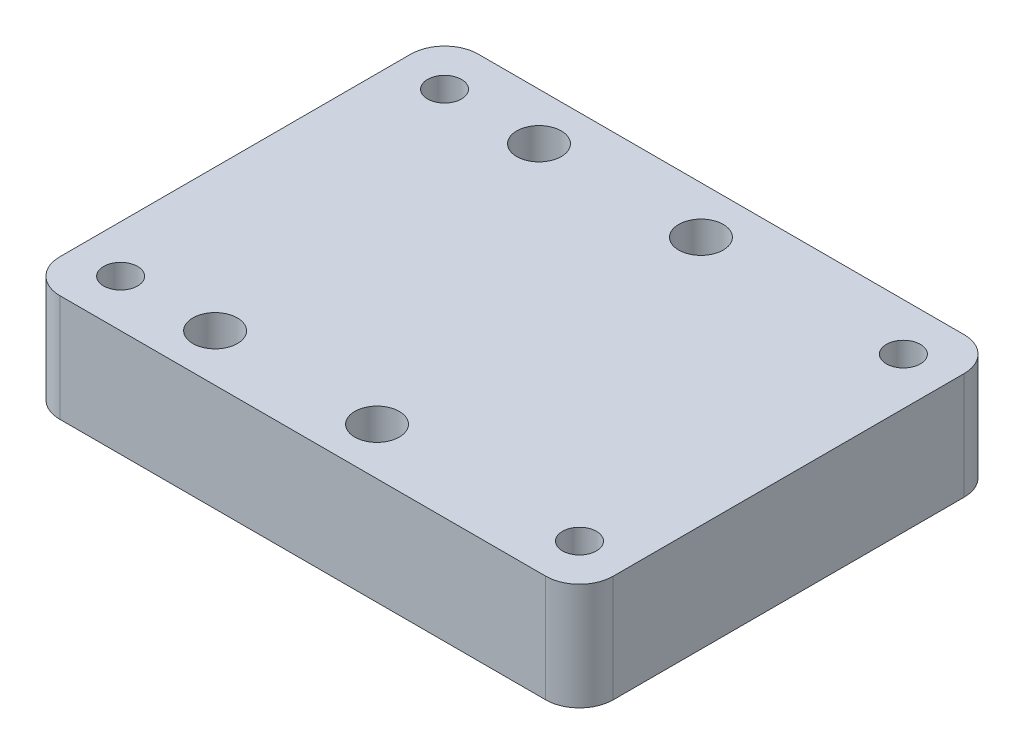
ISO-10303-21;
HEADER;
FILE_DESCRIPTION(('STEP AP214'),'2;1');
FILE_NAME('part.step','',(''),(''),'','','');
FILE_SCHEMA(('AUTOMOTIVE_DESIGN { 1 0 10303 214 1 1 1 1 }'));
ENDSEC;
DATA;
#1=APPLICATION_CONTEXT('core data for automotive mechanical design processes');
#2=APPLICATION_PROTOCOL_DEFINITION('international standard','automotive_design',2000,#1);
#3=PRODUCT_CONTEXT('',#1,'mechanical');
#4=PRODUCT('Part','Part','',(#3));
#5=PRODUCT_RELATED_PRODUCT_CATEGORY('part','',(#4));
#6=PRODUCT_DEFINITION_FORMATION('','',#4);
#7=PRODUCT_DEFINITION_CONTEXT('part definition',#1,'design');
#8=PRODUCT_DEFINITION('design','',#6,#7);
#9=PRODUCT_DEFINITION_SHAPE('','',#8);
#10=(LENGTH_UNIT() NAMED_UNIT(*) SI_UNIT(.MILLI.,.METRE.));
#11=(NAMED_UNIT(*) PLANE_ANGLE_UNIT() SI_UNIT($,.RADIAN.));
#12=(NAMED_UNIT(*) SI_UNIT($,.STERADIAN.) SOLID_ANGLE_UNIT());
#13=UNCERTAINTY_MEASURE_WITH_UNIT(LENGTH_MEASURE(1.E-05),#10,'distance_accuracy_value','');
#14=(GEOMETRIC_REPRESENTATION_CONTEXT(3) GLOBAL_UNCERTAINTY_ASSIGNED_CONTEXT((#13)) GLOBAL_UNIT_ASSIGNED_CONTEXT((#10,
#11,#12)) REPRESENTATION_CONTEXT('',''));
#15=CARTESIAN_POINT('',(0.,0.,0.));
#16=DIRECTION('',(0.,0.,1.));
#17=DIRECTION('',(1.,0.,0.));
#18=AXIS2_PLACEMENT_3D('',#15,#16,#17);
#19=CARTESIAN_POINT('',(399.991475985945,15.875,37.6694276450719));
#20=DIRECTION('',(0.,1.,0.));
#21=DIRECTION('',(1.,0.,0.));
#22=AXIS2_PLACEMENT_3D('',#19,#20,#21);
#23=PLANE('',#22);
#24=CARTESIAN_POINT('',(365.991475985945,15.875,61.6694276450719));
#25=DIRECTION('',(0.,-1.,0.));
#26=DIRECTION('',(0.,0.,-1.));
#27=AXIS2_PLACEMENT_3D('',#24,#25,#26);
#28=CIRCLE('',#27,2.51749999999977);
#29=CARTESIAN_POINT('',(365.991475985945,15.875,64.1869276450719));
#30=VERTEX_POINT('',#29);
#31=EDGE_CURVE('E25',#30,#30,#28,.T.);
#32=ORIENTED_EDGE('',*,*,#31,.T.);
#33=EDGE_LOOP('',(#32));
#34=FACE_BOUND('',#33,.T.);
#35=CARTESIAN_POINT('',(365.991475985945,15.875,13.6694276450719));
#36=DIRECTION('',(0.,-1.,0.));
#37=DIRECTION('',(0.,0.,-1.));
#38=AXIS2_PLACEMENT_3D('',#35,#36,#37);
#39=CIRCLE('',#38,2.51749999999977);
#40=CARTESIAN_POINT('',(365.991475985945,15.875,16.1869276450719));
#41=VERTEX_POINT('',#40);
#42=EDGE_CURVE('E43',#41,#41,#39,.T.);
#43=ORIENTED_EDGE('',*,*,#42,.T.);
#44=EDGE_LOOP('',(#43));
#45=FACE_BOUND('',#44,.T.);
#46=CARTESIAN_POINT('',(433.991475985945,15.875,61.6694276450719));
#47=DIRECTION('',(0.,-1.,0.));
#48=DIRECTION('',(0.,0.,-1.));
#49=AXIS2_PLACEMENT_3D('',#46,#47,#48);
#50=CIRCLE('',#49,2.51749999999977);
#51=CARTESIAN_POINT('',(433.991475985945,15.875,64.1869276450719));
#52=VERTEX_POINT('',#51);
#53=EDGE_CURVE('E271',#52,#52,#50,.T.);
#54=ORIENTED_EDGE('',*,*,#53,.T.);
#55=EDGE_LOOP('',(#54));
#56=FACE_BOUND('',#55,.T.);
#57=CARTESIAN_POINT('',(433.991475985945,15.875,13.6694276450719));
#58=DIRECTION('',(0.,-1.,0.));
#59=DIRECTION('',(0.,0.,-1.));
#60=AXIS2_PLACEMENT_3D('',#57,#58,#59);
#61=CIRCLE('',#60,2.51749999999977);
#62=CARTESIAN_POINT('',(433.991475985945,15.875,16.1869276450719));
#63=VERTEX_POINT('',#62);
#64=EDGE_CURVE('E270',#63,#63,#61,.T.);
#65=ORIENTED_EDGE('',*,*,#64,.T.);
#66=EDGE_LOOP('',(#65));
#67=FACE_BOUND('',#66,.T.);
#68=CARTESIAN_POINT('',(379.991475985944,15.875,13.6694276450718));
#69=DIRECTION('',(0.,-1.,0.));
#70=DIRECTION('',(0.,0.,-1.));
#71=AXIS2_PLACEMENT_3D('',#68,#69,#70);
#72=CIRCLE('',#71,3.3);
#73=CARTESIAN_POINT('',(379.991475985944,15.875,16.9694276450718));
#74=VERTEX_POINT('',#73);
#75=EDGE_CURVE('E387',#74,#74,#72,.T.);
#76=ORIENTED_EDGE('',*,*,#75,.T.);
#77=EDGE_LOOP('',(#76));
#78=FACE_BOUND('',#77,.T.);
#79=CARTESIAN_POINT('',(403.991475985944,15.875,61.6694276450718));
#80=DIRECTION('',(0.,-1.,0.));
#81=DIRECTION('',(0.,0.,-1.));
#82=AXIS2_PLACEMENT_3D('',#79,#80,#81);
#83=CIRCLE('',#82,3.3);
#84=CARTESIAN_POINT('',(403.991475985944,15.875,64.9694276450718));
#85=VERTEX_POINT('',#84);
#86=EDGE_CURVE('E365',#85,#85,#83,.T.);
#87=ORIENTED_EDGE('',*,*,#86,.T.);
#88=EDGE_LOOP('',(#87));
#89=FACE_BOUND('',#88,.T.);
#90=CARTESIAN_POINT('',(379.991475985944,15.875,61.6694276450718));
#91=DIRECTION('',(0.,-1.,0.));
#92=DIRECTION('',(0.,0.,-1.));
#93=AXIS2_PLACEMENT_3D('',#90,#91,#92);
#94=CIRCLE('',#93,3.3);
#95=CARTESIAN_POINT('',(379.991475985944,15.875,64.9694276450718));
#96=VERTEX_POINT('',#95);
#97=EDGE_CURVE('E305',#96,#96,#94,.T.);
#98=ORIENTED_EDGE('',*,*,#97,.T.);
#99=EDGE_LOOP('',(#98));
#100=FACE_BOUND('',#99,.T.);
#101=CARTESIAN_POINT('',(403.991475985944,15.875,13.6694276450718));
#102=DIRECTION('',(0.,-1.,0.));
#103=DIRECTION('',(0.,0.,-1.));
#104=AXIS2_PLACEMENT_3D('',#101,#102,#103);
#105=CIRCLE('',#104,3.3);
#106=CARTESIAN_POINT('',(403.991475985944,15.875,16.9694276450718));
#107=VERTEX_POINT('',#106);
#108=EDGE_CURVE('E317',#107,#107,#105,.T.);
#109=ORIENTED_EDGE('',*,*,#108,.T.);
#110=EDGE_LOOP('',(#109));
#111=FACE_BOUND('',#110,.T.);
#112=CARTESIAN_POINT('',(435.991475985945,15.875,63.6694276450719));
#113=DIRECTION('',(0.,-1.,0.));
#114=DIRECTION('',(0.707106781186548,0.,0.707106781186548));
#115=AXIS2_PLACEMENT_3D('',#112,#113,#114);
#116=CIRCLE('',#115,5.);
#117=CARTESIAN_POINT('',(440.991475985945,15.875,63.6694276450719));
#118=VERTEX_POINT('',#117);
#119=CARTESIAN_POINT('',(435.991475985945,15.875,68.6694276450719));
#120=VERTEX_POINT('',#119);
#121=EDGE_CURVE('E327',#118,#120,#116,.T.);
#122=ORIENTED_EDGE('',*,*,#121,.F.);
#123=DIRECTION('',(0.,0.,-1.));
#124=VECTOR('',#123,1.);
#125=CARTESIAN_POINT('',(440.991475985945,15.875,6.66942764507193));
#126=LINE('',#125,#124);
#127=CARTESIAN_POINT('',(440.991475985945,15.875,11.6694276450719));
#128=VERTEX_POINT('',#127);
#129=EDGE_CURVE('E238',#118,#128,#126,.T.);
#130=ORIENTED_EDGE('',*,*,#129,.T.);
#131=CARTESIAN_POINT('',(435.991475985945,15.875,11.6694276450719));
#132=DIRECTION('',(0.,-1.,0.));
#133=DIRECTION('',(0.707106781186548,0.,-0.707106781186548));
#134=AXIS2_PLACEMENT_3D('',#131,#132,#133);
#135=CIRCLE('',#134,5.);
#136=CARTESIAN_POINT('',(435.991475985945,15.875,6.66942764507193));
#137=VERTEX_POINT('',#136);
#138=EDGE_CURVE('E231',#137,#128,#135,.T.);
#139=ORIENTED_EDGE('',*,*,#138,.F.);
#140=DIRECTION('',(-1.,0.,0.));
#141=VECTOR('',#140,1.);
#142=CARTESIAN_POINT('',(358.991475985945,15.875,6.66942764507193));
#143=LINE('',#142,#141);
#144=CARTESIAN_POINT('',(363.991475985945,15.875,6.66942764507193));
#145=VERTEX_POINT('',#144);
#146=EDGE_CURVE('E220',#137,#145,#143,.T.);
#147=ORIENTED_EDGE('',*,*,#146,.T.);
#148=CARTESIAN_POINT('',(363.991475985945,15.875,11.6694276450719));
#149=DIRECTION('',(0.,-1.,0.));
#150=DIRECTION('',(-0.707106781186548,0.,-0.707106781186548));
#151=AXIS2_PLACEMENT_3D('',#148,#149,#150);
#152=CIRCLE('',#151,5.);
#153=CARTESIAN_POINT('',(358.991475985945,15.875,11.6694276450719));
#154=VERTEX_POINT('',#153);
#155=EDGE_CURVE('E257',#154,#145,#152,.T.);
#156=ORIENTED_EDGE('',*,*,#155,.F.);
#157=DIRECTION('',(0.,0.,1.));
#158=VECTOR('',#157,1.);
#159=CARTESIAN_POINT('',(358.991475985945,15.875,68.6694276450719));
#160=LINE('',#159,#158);
#161=CARTESIAN_POINT('',(358.991475985945,15.875,63.6694276450719));
#162=VERTEX_POINT('',#161);
#163=EDGE_CURVE('E11',#154,#162,#160,.T.);
#164=ORIENTED_EDGE('',*,*,#163,.T.);
#165=CARTESIAN_POINT('',(363.991475985945,15.875,63.6694276450719));
#166=DIRECTION('',(0.,-1.,0.));
#167=DIRECTION('',(-0.707106781186548,0.,0.707106781186548));
#168=AXIS2_PLACEMENT_3D('',#165,#166,#167);
#169=CIRCLE('',#168,5.);
#170=CARTESIAN_POINT('',(363.991475985945,15.875,68.6694276450719));
#171=VERTEX_POINT('',#170);
#172=EDGE_CURVE('E226',#171,#162,#169,.T.);
#173=ORIENTED_EDGE('',*,*,#172,.F.);
#174=DIRECTION('',(1.,0.,0.));
#175=VECTOR('',#174,1.);
#176=CARTESIAN_POINT('',(440.991475985945,15.875,68.6694276450719));
#177=LINE('',#176,#175);
#178=EDGE_CURVE('E77',#171,#120,#177,.T.);
#179=ORIENTED_EDGE('',*,*,#178,.T.);
#180=EDGE_LOOP('',(#122,#130,#139,#147,#156,#164,#173,#179));
#181=FACE_BOUND('',#180,.T.);
#182=ADVANCED_FACE('F17',(#34,#45,#56,#67,#78,#89,#100,#111,#181),#23,.T.);
#183=CARTESIAN_POINT('',(358.991475985945,0.,6.66942764507193));
#184=DIRECTION('',(-1.,0.,0.));
#185=DIRECTION('',(0.,0.,1.));
#186=AXIS2_PLACEMENT_3D('',#183,#184,#185);
#187=PLANE('',#186);
#188=DIRECTION('',(0.,-1.,0.));
#189=VECTOR('',#188,1.);
#190=CARTESIAN_POINT('',(358.991475985945,0.,63.6694276450719));
#191=LINE('',#190,#189);
#192=CARTESIAN_POINT('',(358.991475985945,0.,63.6694276450719));
#193=VERTEX_POINT('',#192);
#194=EDGE_CURVE('E252',#162,#193,#191,.T.);
#195=ORIENTED_EDGE('',*,*,#194,.F.);
#196=ORIENTED_EDGE('',*,*,#163,.F.);
#197=DIRECTION('',(0.,1.,0.));
#198=VECTOR('',#197,1.);
#199=CARTESIAN_POINT('',(358.991475985945,0.,11.6694276450719));
#200=LINE('',#199,#198);
#201=CARTESIAN_POINT('',(358.991475985945,0.,11.6694276450719));
#202=VERTEX_POINT('',#201);
#203=EDGE_CURVE('E263',#202,#154,#200,.T.);
#204=ORIENTED_EDGE('',*,*,#203,.F.);
#205=DIRECTION('',(0.,0.,-1.));
#206=VECTOR('',#205,1.);
#207=CARTESIAN_POINT('',(358.991475985945,0.,68.6694276450719));
#208=LINE('',#207,#206);
#209=EDGE_CURVE('E450',#193,#202,#208,.T.);
#210=ORIENTED_EDGE('',*,*,#209,.F.);
#211=EDGE_LOOP('',(#195,#196,#204,#210));
#212=FACE_BOUND('',#211,.T.);
#213=ADVANCED_FACE('F468',(#212),#187,.T.);
#214=CARTESIAN_POINT('',(365.991475985945,7.93749999999986,61.6694276450719));
#215=DIRECTION('',(0.,1.,0.));
#216=DIRECTION('',(0.,0.,-1.));
#217=AXIS2_PLACEMENT_3D('',#214,#215,#216);
#218=CYLINDRICAL_SURFACE('',#217,2.5175);
#219=CARTESIAN_POINT('',(365.991475985945,0.440130403437934,61.6694276450719));
#220=DIRECTION('',(0.,-1.,0.));
#221=DIRECTION('',(0.,0.,-1.));
#222=AXIS2_PLACEMENT_3D('',#219,#220,#221);
#223=CIRCLE('',#222,2.5175);
#224=CARTESIAN_POINT('',(365.991475985945,0.440130403437934,64.1869276450719));
#225=VERTEX_POINT('',#224);
#226=EDGE_CURVE('E423',#225,#225,#223,.T.);
#227=ORIENTED_EDGE('',*,*,#226,.T.);
#228=DIRECTION('',(0.,1.,0.));
#229=VECTOR('',#228,1.);
#230=CARTESIAN_POINT('',(365.991475985945,7.93749999999986,64.1869276450719));
#231=LINE('',#230,#229);
#232=EDGE_CURVE('E276',#225,#30,#231,.T.);
#233=ORIENTED_EDGE('',*,*,#232,.T.);
#234=ORIENTED_EDGE('',*,*,#31,.F.);
#235=ORIENTED_EDGE('',*,*,#232,.F.);
#236=EDGE_LOOP('',(#227,#233,#234,#235));
#237=FACE_BOUND('',#236,.T.);
#238=ADVANCED_FACE('F494',(#237),#218,.F.);
#239=CARTESIAN_POINT('',(365.991475985945,7.93749999999986,13.6694276450719));
#240=DIRECTION('',(0.,1.,0.));
#241=DIRECTION('',(0.,0.,-1.));
#242=AXIS2_PLACEMENT_3D('',#239,#240,#241);
#243=CYLINDRICAL_SURFACE('',#242,2.5175);
#244=CARTESIAN_POINT('',(365.991475985945,0.440130403437934,13.6694276450719));
#245=DIRECTION('',(0.,-1.,0.));
#246=DIRECTION('',(0.,0.,-1.));
#247=AXIS2_PLACEMENT_3D('',#244,#245,#246);
#248=CIRCLE('',#247,2.5175);
#249=CARTESIAN_POINT('',(365.991475985945,0.440130403437934,16.1869276450719));
#250=VERTEX_POINT('',#249);
#251=EDGE_CURVE('E408',#250,#250,#248,.T.);
#252=ORIENTED_EDGE('',*,*,#251,.T.);
#253=DIRECTION('',(0.,1.,0.));
#254=VECTOR('',#253,1.);
#255=CARTESIAN_POINT('',(365.991475985945,7.93749999999986,16.1869276450719));
#256=LINE('',#255,#254);
#257=EDGE_CURVE('E273',#250,#41,#256,.T.);
#258=ORIENTED_EDGE('',*,*,#257,.T.);
#259=ORIENTED_EDGE('',*,*,#42,.F.);
#260=ORIENTED_EDGE('',*,*,#257,.F.);
#261=EDGE_LOOP('',(#252,#258,#259,#260));
#262=FACE_BOUND('',#261,.T.);
#263=ADVANCED_FACE('F547',(#262),#243,.F.);
#264=CARTESIAN_POINT('',(433.991475985945,7.93749999999986,61.6694276450719));
#265=DIRECTION('',(0.,1.,0.));
#266=DIRECTION('',(0.,0.,-1.));
#267=AXIS2_PLACEMENT_3D('',#264,#265,#266);
#268=CYLINDRICAL_SURFACE('',#267,2.5175);
#269=CARTESIAN_POINT('',(433.991475985945,0.440130403437756,61.6694276450719));
#270=DIRECTION('',(0.,-1.,0.));
#271=DIRECTION('',(0.,0.,-1.));
#272=AXIS2_PLACEMENT_3D('',#269,#270,#271);
#273=CIRCLE('',#272,2.5175);
#274=CARTESIAN_POINT('',(433.991475985945,0.440130403437756,64.1869276450719));
#275=VERTEX_POINT('',#274);
#276=EDGE_CURVE('E312',#275,#275,#273,.T.);
#277=ORIENTED_EDGE('',*,*,#276,.T.);
#278=DIRECTION('',(0.,1.,0.));
#279=VECTOR('',#278,1.);
#280=CARTESIAN_POINT('',(433.991475985945,7.93749999999986,64.1869276450719));
#281=LINE('',#280,#279);
#282=EDGE_CURVE('E269',#275,#52,#281,.T.);
#283=ORIENTED_EDGE('',*,*,#282,.T.);
#284=ORIENTED_EDGE('',*,*,#53,.F.);
#285=ORIENTED_EDGE('',*,*,#282,.F.);
#286=EDGE_LOOP('',(#277,#283,#284,#285));
#287=FACE_BOUND('',#286,.T.);
#288=ADVANCED_FACE('F539',(#287),#268,.F.);
#289=CARTESIAN_POINT('',(433.991475985945,7.93749999999986,13.6694276450719));
#290=DIRECTION('',(0.,1.,0.));
#291=DIRECTION('',(0.,0.,-1.));
#292=AXIS2_PLACEMENT_3D('',#289,#290,#291);
#293=CYLINDRICAL_SURFACE('',#292,2.5175);
#294=CARTESIAN_POINT('',(433.991475985945,0.440130403437756,13.6694276450719));
#295=DIRECTION('',(0.,-1.,0.));
#296=DIRECTION('',(0.,0.,-1.));
#297=AXIS2_PLACEMENT_3D('',#294,#295,#296);
#298=CIRCLE('',#297,2.5175);
#299=CARTESIAN_POINT('',(433.991475985945,0.440130403437756,16.1869276450719));
#300=VERTEX_POINT('',#299);
#301=EDGE_CURVE('E393',#300,#300,#298,.T.);
#302=ORIENTED_EDGE('',*,*,#301,.T.);
#303=DIRECTION('',(0.,1.,0.));
#304=VECTOR('',#303,1.);
#305=CARTESIAN_POINT('',(433.991475985945,7.93749999999986,16.1869276450719));
#306=LINE('',#305,#304);
#307=EDGE_CURVE('E266',#300,#63,#306,.T.);
#308=ORIENTED_EDGE('',*,*,#307,.T.);
#309=ORIENTED_EDGE('',*,*,#64,.F.);
#310=ORIENTED_EDGE('',*,*,#307,.F.);
#311=EDGE_LOOP('',(#302,#308,#309,#310));
#312=FACE_BOUND('',#311,.T.);
#313=ADVANCED_FACE('F538',(#312),#293,.F.);
#314=CARTESIAN_POINT('',(363.991475985945,0.,11.6694276450719));
#315=DIRECTION('',(0.,1.,0.));
#316=DIRECTION('',(-0.707106781186548,0.,-0.707106781186548));
#317=AXIS2_PLACEMENT_3D('',#314,#315,#316);
#318=CYLINDRICAL_SURFACE('',#317,5.);
#319=ORIENTED_EDGE('',*,*,#155,.T.);
#320=DIRECTION('',(0.,-1.,0.));
#321=VECTOR('',#320,1.);
#322=CARTESIAN_POINT('',(363.991475985945,0.,6.66942764507193));
#323=LINE('',#322,#321);
#324=CARTESIAN_POINT('',(363.991475985945,0.,6.66942764507193));
#325=VERTEX_POINT('',#324);
#326=EDGE_CURVE('E224',#145,#325,#323,.T.);
#327=ORIENTED_EDGE('',*,*,#326,.T.);
#328=CARTESIAN_POINT('',(363.991475985945,0.,11.6694276450719));
#329=DIRECTION('',(0.,1.,0.));
#330=DIRECTION('',(-0.707106781186548,0.,-0.707106781186548));
#331=AXIS2_PLACEMENT_3D('',#328,#329,#330);
#332=CIRCLE('',#331,5.);
#333=EDGE_CURVE('E452',#325,#202,#332,.T.);
#334=ORIENTED_EDGE('',*,*,#333,.T.);
#335=ORIENTED_EDGE('',*,*,#203,.T.);
#336=EDGE_LOOP('',(#319,#327,#334,#335));
#337=FACE_BOUND('',#336,.T.);
#338=ADVANCED_FACE('F470',(#337),#318,.T.);
#339=CARTESIAN_POINT('',(358.991475985945,0.,68.6694276450719));
#340=DIRECTION('',(0.,0.,1.));
#341=DIRECTION('',(1.,0.,0.));
#342=AXIS2_PLACEMENT_3D('',#339,#340,#341);
#343=PLANE('',#342);
#344=DIRECTION('',(0.,-1.,0.));
#345=VECTOR('',#344,1.);
#346=CARTESIAN_POINT('',(435.991475985945,0.,68.6694276450719));
#347=LINE('',#346,#345);
#348=CARTESIAN_POINT('',(435.991475985945,0.,68.6694276450719));
#349=VERTEX_POINT('',#348);
#350=EDGE_CURVE('E323',#120,#349,#347,.T.);
#351=ORIENTED_EDGE('',*,*,#350,.F.);
#352=ORIENTED_EDGE('',*,*,#178,.F.);
#353=DIRECTION('',(0.,1.,0.));
#354=VECTOR('',#353,1.);
#355=CARTESIAN_POINT('',(363.991475985945,0.,68.6694276450719));
#356=LINE('',#355,#354);
#357=CARTESIAN_POINT('',(363.991475985945,0.,68.6694276450719));
#358=VERTEX_POINT('',#357);
#359=EDGE_CURVE('E254',#358,#171,#356,.T.);
#360=ORIENTED_EDGE('',*,*,#359,.F.);
#361=DIRECTION('',(-1.,0.,0.));
#362=VECTOR('',#361,1.);
#363=CARTESIAN_POINT('',(440.991475985945,0.,68.6694276450719));
#364=LINE('',#363,#362);
#365=EDGE_CURVE('E445',#349,#358,#364,.T.);
#366=ORIENTED_EDGE('',*,*,#365,.F.);
#367=EDGE_LOOP('',(#351,#352,#360,#366));
#368=FACE_BOUND('',#367,.T.);
#369=ADVANCED_FACE('F473',(#368),#343,.T.);
#370=CARTESIAN_POINT('',(363.991475985945,0.,63.6694276450719));
#371=DIRECTION('',(0.,1.,0.));
#372=DIRECTION('',(-0.707106781186548,0.,0.707106781186548));
#373=AXIS2_PLACEMENT_3D('',#370,#371,#372);
#374=CYLINDRICAL_SURFACE('',#373,5.);
#375=ORIENTED_EDGE('',*,*,#172,.T.);
#376=ORIENTED_EDGE('',*,*,#194,.T.);
#377=CARTESIAN_POINT('',(363.991475985945,0.,63.6694276450719));
#378=DIRECTION('',(0.,1.,0.));
#379=DIRECTION('',(-0.707106781186548,0.,0.707106781186548));
#380=AXIS2_PLACEMENT_3D('',#377,#378,#379);
#381=CIRCLE('',#380,5.);
#382=EDGE_CURVE('E446',#193,#358,#381,.T.);
#383=ORIENTED_EDGE('',*,*,#382,.T.);
#384=ORIENTED_EDGE('',*,*,#359,.T.);
#385=EDGE_LOOP('',(#375,#376,#383,#384));
#386=FACE_BOUND('',#385,.T.);
#387=ADVANCED_FACE('F469',(#386),#374,.T.);
#388=CARTESIAN_POINT('',(440.991475985945,0.,6.66942764507193));
#389=DIRECTION('',(0.,0.,-1.));
#390=DIRECTION('',(0.,-1.,0.));
#391=AXIS2_PLACEMENT_3D('',#388,#389,#390);
#392=PLANE('',#391);
#393=DIRECTION('',(0.,1.,0.));
#394=VECTOR('',#393,1.);
#395=CARTESIAN_POINT('',(435.991475985945,0.,6.66942764507193));
#396=LINE('',#395,#394);
#397=CARTESIAN_POINT('',(435.991475985945,0.,6.66942764507193));
#398=VERTEX_POINT('',#397);
#399=EDGE_CURVE('E222',#398,#137,#396,.T.);
#400=ORIENTED_EDGE('',*,*,#399,.F.);
#401=DIRECTION('',(1.,0.,0.));
#402=VECTOR('',#401,1.);
#403=CARTESIAN_POINT('',(358.991475985945,0.,6.66942764507193));
#404=LINE('',#403,#402);
#405=EDGE_CURVE('E243',#325,#398,#404,.T.);
#406=ORIENTED_EDGE('',*,*,#405,.F.);
#407=ORIENTED_EDGE('',*,*,#326,.F.);
#408=ORIENTED_EDGE('',*,*,#146,.F.);
#409=EDGE_LOOP('',(#400,#406,#407,#408));
#410=FACE_BOUND('',#409,.T.);
#411=ADVANCED_FACE('F218',(#410),#392,.T.);
#412=CARTESIAN_POINT('',(435.991475985945,0.,11.6694276450719));
#413=DIRECTION('',(0.,1.,0.));
#414=DIRECTION('',(0.707106781186548,0.,-0.707106781186548));
#415=AXIS2_PLACEMENT_3D('',#412,#413,#414);
#416=CYLINDRICAL_SURFACE('',#415,5.);
#417=ORIENTED_EDGE('',*,*,#138,.T.);
#418=DIRECTION('',(0.,-1.,0.));
#419=VECTOR('',#418,1.);
#420=CARTESIAN_POINT('',(440.991475985945,0.,11.6694276450719));
#421=LINE('',#420,#419);
#422=CARTESIAN_POINT('',(440.991475985945,0.,11.6694276450719));
#423=VERTEX_POINT('',#422);
#424=EDGE_CURVE('E440',#128,#423,#421,.T.);
#425=ORIENTED_EDGE('',*,*,#424,.T.);
#426=CARTESIAN_POINT('',(435.991475985945,0.,11.6694276450719));
#427=DIRECTION('',(0.,1.,0.));
#428=DIRECTION('',(0.707106781186548,0.,-0.707106781186548));
#429=AXIS2_PLACEMENT_3D('',#426,#427,#428);
#430=CIRCLE('',#429,5.);
#431=EDGE_CURVE('E233',#423,#398,#430,.T.);
#432=ORIENTED_EDGE('',*,*,#431,.T.);
#433=ORIENTED_EDGE('',*,*,#399,.T.);
#434=EDGE_LOOP('',(#417,#425,#432,#433));
#435=FACE_BOUND('',#434,.T.);
#436=ADVANCED_FACE('F228',(#435),#416,.T.);
#437=CARTESIAN_POINT('',(399.991475985945,0.,37.6694276450719));
#438=DIRECTION('',(0.,1.,0.));
#439=DIRECTION('',(1.,0.,0.));
#440=AXIS2_PLACEMENT_3D('',#437,#438,#439);
#441=PLANE('',#440);
#442=CARTESIAN_POINT('',(365.991475985945,1.81243908770057E-13,61.6694276450748));
#443=DIRECTION('',(0.,1.,0.));
#444=DIRECTION('',(0.,0.,-1.));
#445=AXIS2_PLACEMENT_3D('',#442,#443,#444);
#446=CIRCLE('',#445,3.25000000000011);
#447=CARTESIAN_POINT('',(365.991475985945,1.75554015768853E-13,64.9194276450749));
#448=VERTEX_POINT('',#447);
#449=EDGE_CURVE('E413',#448,#448,#446,.T.);
#450=ORIENTED_EDGE('',*,*,#449,.T.);
#451=EDGE_LOOP('',(#450));
#452=FACE_BOUND('',#451,.T.);
#453=CARTESIAN_POINT('',(365.991475985945,2.04281036531029E-13,13.6694276450748));
#454=DIRECTION('',(0.,1.,0.));
#455=DIRECTION('',(0.,0.,-1.));
#456=AXIS2_PLACEMENT_3D('',#453,#454,#455);
#457=CIRCLE('',#456,3.25000000000007);
#458=CARTESIAN_POINT('',(365.991475985945,1.92623694772465E-13,16.9194276450749));
#459=VERTEX_POINT('',#458);
#460=EDGE_CURVE('E309',#459,#459,#457,.T.);
#461=ORIENTED_EDGE('',*,*,#460,.T.);
#462=EDGE_LOOP('',(#461));
#463=FACE_BOUND('',#462,.T.);
#464=CARTESIAN_POINT('',(433.991475985945,-2.04281036531029E-13,61.6694276450748));
#465=DIRECTION('',(0.,1.,0.));
#466=DIRECTION('',(0.,0.,-1.));
#467=AXIS2_PLACEMENT_3D('',#464,#465,#466);
#468=CIRCLE('',#467,3.25000000000046);
#469=CARTESIAN_POINT('',(433.991475985945,-2.09138262263764E-13,64.9194276450753));
#470=VERTEX_POINT('',#469);
#471=EDGE_CURVE('E398',#470,#470,#468,.T.);
#472=ORIENTED_EDGE('',*,*,#471,.T.);
#473=EDGE_LOOP('',(#472));
#474=FACE_BOUND('',#473,.T.);
#475=CARTESIAN_POINT('',(433.991475985945,-1.81243908770057E-13,13.6694276450748));
#476=DIRECTION('',(0.,1.,0.));
#477=DIRECTION('',(0.,0.,-1.));
#478=AXIS2_PLACEMENT_3D('',#475,#476,#477);
#479=CIRCLE('',#478,3.25000000000042);
#480=CARTESIAN_POINT('',(433.991475985945,-1.84297022087776E-13,16.9194276450752));
#481=VERTEX_POINT('',#480);
#482=EDGE_CURVE('E386',#481,#481,#479,.T.);
#483=ORIENTED_EDGE('',*,*,#482,.T.);
#484=EDGE_LOOP('',(#483));
#485=FACE_BOUND('',#484,.T.);
#486=CARTESIAN_POINT('',(379.991475985945,0.,13.6694276450718));
#487=DIRECTION('',(0.,1.,0.));
#488=DIRECTION('',(0.,0.,-1.));
#489=AXIS2_PLACEMENT_3D('',#486,#487,#488);
#490=CIRCLE('',#489,5.5);
#491=CARTESIAN_POINT('',(379.991475985944,0.,19.1694276450718));
#492=VERTEX_POINT('',#491);
#493=EDGE_CURVE('E374',#492,#492,#490,.T.);
#494=ORIENTED_EDGE('',*,*,#493,.T.);
#495=EDGE_LOOP('',(#494));
#496=FACE_BOUND('',#495,.T.);
#497=CARTESIAN_POINT('',(403.991475985944,0.,61.6694276450718));
#498=DIRECTION('',(0.,1.,0.));
#499=DIRECTION('',(0.,0.,-1.));
#500=AXIS2_PLACEMENT_3D('',#497,#498,#499);
#501=CIRCLE('',#500,5.5);
#502=CARTESIAN_POINT('',(403.991475985944,0.,67.1694276450718));
#503=VERTEX_POINT('',#502);
#504=EDGE_CURVE('E300',#503,#503,#501,.T.);
#505=ORIENTED_EDGE('',*,*,#504,.T.);
#506=EDGE_LOOP('',(#505));
#507=FACE_BOUND('',#506,.T.);
#508=CARTESIAN_POINT('',(379.991475985944,0.,61.6694276450718));
#509=DIRECTION('',(0.,1.,0.));
#510=DIRECTION('',(0.,0.,-1.));
#511=AXIS2_PLACEMENT_3D('',#508,#509,#510);
#512=CIRCLE('',#511,5.5);
#513=CARTESIAN_POINT('',(379.991475985944,0.,67.1694276450718));
#514=VERTEX_POINT('',#513);
#515=EDGE_CURVE('E344',#514,#514,#512,.T.);
#516=ORIENTED_EDGE('',*,*,#515,.T.);
#517=EDGE_LOOP('',(#516));
#518=FACE_BOUND('',#517,.T.);
#519=CARTESIAN_POINT('',(403.991475985944,0.,13.6694276450718));
#520=DIRECTION('',(0.,1.,0.));
#521=DIRECTION('',(0.,0.,-1.));
#522=AXIS2_PLACEMENT_3D('',#519,#520,#521);
#523=CIRCLE('',#522,5.5);
#524=CARTESIAN_POINT('',(403.991475985944,0.,19.1694276450718));
#525=VERTEX_POINT('',#524);
#526=EDGE_CURVE('E310',#525,#525,#523,.T.);
#527=ORIENTED_EDGE('',*,*,#526,.T.);
#528=EDGE_LOOP('',(#527));
#529=FACE_BOUND('',#528,.T.);
#530=CARTESIAN_POINT('',(435.991475985945,0.,63.6694276450719));
#531=DIRECTION('',(0.,1.,0.));
#532=DIRECTION('',(0.707106781186548,0.,0.707106781186548));
#533=AXIS2_PLACEMENT_3D('',#530,#531,#532);
#534=CIRCLE('',#533,5.);
#535=CARTESIAN_POINT('',(440.991475985945,0.,63.6694276450719));
#536=VERTEX_POINT('',#535);
#537=EDGE_CURVE('E330',#349,#536,#534,.T.);
#538=ORIENTED_EDGE('',*,*,#537,.F.);
#539=ORIENTED_EDGE('',*,*,#365,.T.);
#540=ORIENTED_EDGE('',*,*,#382,.F.);
#541=ORIENTED_EDGE('',*,*,#209,.T.);
#542=ORIENTED_EDGE('',*,*,#333,.F.);
#543=ORIENTED_EDGE('',*,*,#405,.T.);
#544=ORIENTED_EDGE('',*,*,#431,.F.);
#545=DIRECTION('',(0.,0.,1.));
#546=VECTOR('',#545,1.);
#547=CARTESIAN_POINT('',(440.991475985945,0.,6.66942764507193));
#548=LINE('',#547,#546);
#549=EDGE_CURVE('E432',#423,#536,#548,.T.);
#550=ORIENTED_EDGE('',*,*,#549,.T.);
#551=EDGE_LOOP('',(#538,#539,#540,#541,#542,#543,#544,#550));
#552=FACE_BOUND('',#551,.T.);
#553=ADVANCED_FACE('F462',(#452,#463,#474,#485,#496,#507,#518,#529,#552),#441,.F.);
#554=CARTESIAN_POINT('',(440.991475985945,0.,68.6694276450719));
#555=DIRECTION('',(1.,0.,0.));
#556=DIRECTION('',(0.,1.,0.));
#557=AXIS2_PLACEMENT_3D('',#554,#555,#556);
#558=PLANE('',#557);
#559=DIRECTION('',(0.,1.,0.));
#560=VECTOR('',#559,1.);
#561=CARTESIAN_POINT('',(440.991475985945,0.,63.6694276450719));
#562=LINE('',#561,#560);
#563=EDGE_CURVE('E429',#536,#118,#562,.T.);
#564=ORIENTED_EDGE('',*,*,#563,.F.);
#565=ORIENTED_EDGE('',*,*,#549,.F.);
#566=ORIENTED_EDGE('',*,*,#424,.F.);
#567=ORIENTED_EDGE('',*,*,#129,.F.);
#568=EDGE_LOOP('',(#564,#565,#566,#567));
#569=FACE_BOUND('',#568,.T.);
#570=ADVANCED_FACE('F480',(#569),#558,.T.);
#571=CARTESIAN_POINT('',(435.991475985945,0.,63.6694276450719));
#572=DIRECTION('',(0.,1.,0.));
#573=DIRECTION('',(0.707106781186548,0.,0.707106781186548));
#574=AXIS2_PLACEMENT_3D('',#571,#572,#573);
#575=CYLINDRICAL_SURFACE('',#574,5.);
#576=ORIENTED_EDGE('',*,*,#121,.T.);
#577=ORIENTED_EDGE('',*,*,#350,.T.);
#578=ORIENTED_EDGE('',*,*,#537,.T.);
#579=ORIENTED_EDGE('',*,*,#563,.T.);
#580=EDGE_LOOP('',(#576,#577,#578,#579));
#581=FACE_BOUND('',#580,.T.);
#582=ADVANCED_FACE('F471',(#581),#575,.T.);
#583=CARTESIAN_POINT('',(365.991475985945,0.976398505920031,61.6694276450748));
#584=DIRECTION('',(0.,-1.,0.));
#585=DIRECTION('',(0.,0.,-1.));
#586=AXIS2_PLACEMENT_3D('',#583,#584,#585);
#587=CONICAL_SURFACE('',#586,1.625,1.02974425867665);
#588=ORIENTED_EDGE('',*,*,#449,.F.);
#589=DIRECTION('',(0.,0.515038074910054,-0.857167300702112));
#590=VECTOR('',#589,1.);
#591=CARTESIAN_POINT('',(365.991475985945,0.97639850592003,63.2944276450748));
#592=LINE('',#591,#590);
#593=EDGE_CURVE('E417',#448,#225,#592,.T.);
#594=ORIENTED_EDGE('',*,*,#593,.T.);
#595=ORIENTED_EDGE('',*,*,#226,.F.);
#596=ORIENTED_EDGE('',*,*,#593,.F.);
#597=EDGE_LOOP('',(#588,#594,#595,#596));
#598=FACE_BOUND('',#597,.T.);
#599=ADVANCED_FACE('F486',(#598),#587,.F.);
#600=CARTESIAN_POINT('',(365.991475985945,0.976398505920031,13.6694276450748));
#601=DIRECTION('',(0.,-1.,0.));
#602=DIRECTION('',(0.,0.,-1.));
#603=AXIS2_PLACEMENT_3D('',#600,#601,#602);
#604=CONICAL_SURFACE('',#603,1.625,1.02974425867665);
#605=ORIENTED_EDGE('',*,*,#460,.F.);
#606=DIRECTION('',(0.,0.515038074910054,-0.857167300702112));
#607=VECTOR('',#606,1.);
#608=CARTESIAN_POINT('',(365.991475985945,0.97639850592003,15.2944276450748));
#609=LINE('',#608,#607);
#610=EDGE_CURVE('E314',#459,#250,#609,.T.);
#611=ORIENTED_EDGE('',*,*,#610,.T.);
#612=ORIENTED_EDGE('',*,*,#251,.F.);
#613=ORIENTED_EDGE('',*,*,#610,.F.);
#614=EDGE_LOOP('',(#605,#611,#612,#613));
#615=FACE_BOUND('',#614,.T.);
#616=ADVANCED_FACE('F574',(#615),#604,.F.);
#617=CARTESIAN_POINT('',(433.991475985945,0.976398505919855,61.6694276450748));
#618=DIRECTION('',(0.,-1.,0.));
#619=DIRECTION('',(0.,0.,-1.));
#620=AXIS2_PLACEMENT_3D('',#617,#618,#619);
#621=CONICAL_SURFACE('',#620,1.625,1.02974425867665);
#622=ORIENTED_EDGE('',*,*,#471,.F.);
#623=DIRECTION('',(0.,0.515038074910054,-0.857167300702112));
#624=VECTOR('',#623,1.);
#625=CARTESIAN_POINT('',(433.991475985945,0.976398505919854,63.2944276450748));
#626=LINE('',#625,#624);
#627=EDGE_CURVE('E401',#470,#275,#626,.T.);
#628=ORIENTED_EDGE('',*,*,#627,.T.);
#629=ORIENTED_EDGE('',*,*,#276,.F.);
#630=ORIENTED_EDGE('',*,*,#627,.F.);
#631=EDGE_LOOP('',(#622,#628,#629,#630));
#632=FACE_BOUND('',#631,.T.);
#633=ADVANCED_FACE('F568',(#632),#621,.F.);
#634=CARTESIAN_POINT('',(433.991475985945,0.976398505919855,13.6694276450748));
#635=DIRECTION('',(0.,-1.,0.));
#636=DIRECTION('',(0.,0.,-1.));
#637=AXIS2_PLACEMENT_3D('',#634,#635,#636);
#638=CONICAL_SURFACE('',#637,1.625,1.02974425867665);
#639=ORIENTED_EDGE('',*,*,#482,.F.);
#640=DIRECTION('',(0.,0.515038074910054,-0.857167300702112));
#641=VECTOR('',#640,1.);
#642=CARTESIAN_POINT('',(433.991475985945,0.976398505919854,15.2944276450748));
#643=LINE('',#642,#641);
#644=EDGE_CURVE('E388',#481,#300,#643,.T.);
#645=ORIENTED_EDGE('',*,*,#644,.T.);
#646=ORIENTED_EDGE('',*,*,#301,.F.);
#647=ORIENTED_EDGE('',*,*,#644,.F.);
#648=EDGE_LOOP('',(#639,#645,#646,#647));
#649=FACE_BOUND('',#648,.T.);
#650=ADVANCED_FACE('F532',(#649),#638,.F.);
#651=CARTESIAN_POINT('',(379.991475985944,8.73125,13.6694276450718));
#652=DIRECTION('',(0.,1.,0.));
#653=DIRECTION('',(0.,0.,-1.));
#654=AXIS2_PLACEMENT_3D('',#651,#652,#653);
#655=CYLINDRICAL_SURFACE('',#654,3.3);
#656=CARTESIAN_POINT('',(379.991475985944,6.00000000000009,13.6694276450718));
#657=DIRECTION('',(0.,1.,0.));
#658=DIRECTION('',(0.,0.,-1.));
#659=AXIS2_PLACEMENT_3D('',#656,#657,#658);
#660=CIRCLE('',#659,3.3);
#661=CARTESIAN_POINT('',(379.991475985944,6.00000000000009,16.9694276450718));
#662=VERTEX_POINT('',#661);
#663=EDGE_CURVE('E371',#662,#662,#660,.T.);
#664=ORIENTED_EDGE('',*,*,#663,.F.);
#665=DIRECTION('',(0.,1.,0.));
#666=VECTOR('',#665,1.);
#667=CARTESIAN_POINT('',(379.991475985944,8.73125,16.9694276450718));
#668=LINE('',#667,#666);
#669=EDGE_CURVE('E385',#662,#74,#668,.T.);
#670=ORIENTED_EDGE('',*,*,#669,.T.);
#671=ORIENTED_EDGE('',*,*,#75,.F.);
#672=ORIENTED_EDGE('',*,*,#669,.F.);
#673=EDGE_LOOP('',(#664,#670,#671,#672));
#674=FACE_BOUND('',#673,.T.);
#675=ADVANCED_FACE('F582',(#674),#655,.F.);
#676=CARTESIAN_POINT('',(379.991475985945,3.00000000000004,13.6694276450718));
#677=DIRECTION('',(0.,1.,0.));
#678=DIRECTION('',(0.,0.,-1.));
#679=AXIS2_PLACEMENT_3D('',#676,#677,#678);
#680=CYLINDRICAL_SURFACE('',#679,5.5);
#681=ORIENTED_EDGE('',*,*,#493,.F.);
#682=DIRECTION('',(0.,1.,0.));
#683=VECTOR('',#682,1.);
#684=CARTESIAN_POINT('',(379.991475985944,3.00000000000004,19.1694276450718));
#685=LINE('',#684,#683);
#686=CARTESIAN_POINT('',(379.991475985944,6.00000000000009,19.1694276450718));
#687=VERTEX_POINT('',#686);
#688=EDGE_CURVE('E377',#492,#687,#685,.T.);
#689=ORIENTED_EDGE('',*,*,#688,.T.);
#690=CARTESIAN_POINT('',(379.991475985945,6.00000000000009,13.6694276450718));
#691=DIRECTION('',(0.,1.,0.));
#692=DIRECTION('',(0.,0.,-1.));
#693=AXIS2_PLACEMENT_3D('',#690,#691,#692);
#694=CIRCLE('',#693,5.5);
#695=EDGE_CURVE('E370',#687,#687,#694,.T.);
#696=ORIENTED_EDGE('',*,*,#695,.T.);
#697=ORIENTED_EDGE('',*,*,#688,.F.);
#698=EDGE_LOOP('',(#681,#689,#696,#697));
#699=FACE_BOUND('',#698,.T.);
#700=ADVANCED_FACE('F593',(#699),#680,.F.);
#701=CARTESIAN_POINT('',(379.991475985945,6.00000000000009,13.6694276450718));
#702=DIRECTION('',(0.,1.,0.));
#703=DIRECTION('',(0.,0.,-1.));
#704=AXIS2_PLACEMENT_3D('',#701,#702,#703);
#705=PLANE('',#704);
#706=ORIENTED_EDGE('',*,*,#663,.T.);
#707=EDGE_LOOP('',(#706));
#708=FACE_BOUND('',#707,.T.);
#709=ORIENTED_EDGE('',*,*,#695,.F.);
#710=EDGE_LOOP('',(#709));
#711=FACE_BOUND('',#710,.T.);
#712=ADVANCED_FACE('F589',(#708,#711),#705,.F.);
#713=CARTESIAN_POINT('',(403.991475985944,8.73124999999987,61.6694276450718));
#714=DIRECTION('',(0.,1.,0.));
#715=DIRECTION('',(0.,0.,-1.));
#716=AXIS2_PLACEMENT_3D('',#713,#714,#715);
#717=CYLINDRICAL_SURFACE('',#716,3.3);
#718=CARTESIAN_POINT('',(403.991475985944,5.99999999999987,61.6694276450718));
#719=DIRECTION('',(0.,1.,0.));
#720=DIRECTION('',(0.,0.,-1.));
#721=AXIS2_PLACEMENT_3D('',#718,#719,#720);
#722=CIRCLE('',#721,3.3);
#723=CARTESIAN_POINT('',(403.991475985944,5.99999999999987,64.9694276450718));
#724=VERTEX_POINT('',#723);
#725=EDGE_CURVE('E353',#724,#724,#722,.T.);
#726=ORIENTED_EDGE('',*,*,#725,.F.);
#727=DIRECTION('',(0.,1.,0.));
#728=VECTOR('',#727,1.);
#729=CARTESIAN_POINT('',(403.991475985944,8.73124999999987,64.9694276450718));
#730=LINE('',#729,#728);
#731=EDGE_CURVE('E296',#724,#85,#730,.T.);
#732=ORIENTED_EDGE('',*,*,#731,.T.);
#733=ORIENTED_EDGE('',*,*,#86,.F.);
#734=ORIENTED_EDGE('',*,*,#731,.F.);
#735=EDGE_LOOP('',(#726,#732,#733,#734));
#736=FACE_BOUND('',#735,.T.);
#737=ADVANCED_FACE('F595',(#736),#717,.F.);
#738=CARTESIAN_POINT('',(403.991475985944,2.99999999999983,61.6694276450718));
#739=DIRECTION('',(0.,1.,0.));
#740=DIRECTION('',(0.,0.,-1.));
#741=AXIS2_PLACEMENT_3D('',#738,#739,#740);
#742=CYLINDRICAL_SURFACE('',#741,5.5);
#743=ORIENTED_EDGE('',*,*,#504,.F.);
#744=DIRECTION('',(0.,1.,0.));
#745=VECTOR('',#744,1.);
#746=CARTESIAN_POINT('',(403.991475985944,2.99999999999983,67.1694276450718));
#747=LINE('',#746,#745);
#748=CARTESIAN_POINT('',(403.991475985944,5.99999999999987,67.1694276450718));
#749=VERTEX_POINT('',#748);
#750=EDGE_CURVE('E292',#503,#749,#747,.T.);
#751=ORIENTED_EDGE('',*,*,#750,.T.);
#752=CARTESIAN_POINT('',(403.991475985944,5.99999999999987,61.6694276450718));
#753=DIRECTION('',(0.,1.,0.));
#754=DIRECTION('',(0.,0.,-1.));
#755=AXIS2_PLACEMENT_3D('',#752,#753,#754);
#756=CIRCLE('',#755,5.5);
#757=EDGE_CURVE('E331',#749,#749,#756,.T.);
#758=ORIENTED_EDGE('',*,*,#757,.T.);
#759=ORIENTED_EDGE('',*,*,#750,.F.);
#760=EDGE_LOOP('',(#743,#751,#758,#759));
#761=FACE_BOUND('',#760,.T.);
#762=ADVANCED_FACE('F637',(#761),#742,.F.);
#763=CARTESIAN_POINT('',(403.991475985944,5.99999999999987,61.6694276450718));
#764=DIRECTION('',(0.,1.,0.));
#765=DIRECTION('',(0.,0.,-1.));
#766=AXIS2_PLACEMENT_3D('',#763,#764,#765);
#767=PLANE('',#766);
#768=ORIENTED_EDGE('',*,*,#725,.T.);
#769=EDGE_LOOP('',(#768));
#770=FACE_BOUND('',#769,.T.);
#771=ORIENTED_EDGE('',*,*,#757,.F.);
#772=EDGE_LOOP('',(#771));
#773=FACE_BOUND('',#772,.T.);
#774=ADVANCED_FACE('F586',(#770,#773),#767,.F.);
#775=CARTESIAN_POINT('',(379.991475985944,8.73125,61.6694276450718));
#776=DIRECTION('',(0.,1.,0.));
#777=DIRECTION('',(0.,0.,-1.));
#778=AXIS2_PLACEMENT_3D('',#775,#776,#777);
#779=CYLINDRICAL_SURFACE('',#778,3.3);
#780=CARTESIAN_POINT('',(379.991475985944,6.00000000000009,61.6694276450718));
#781=DIRECTION('',(0.,1.,0.));
#782=DIRECTION('',(0.,0.,-1.));
#783=AXIS2_PLACEMENT_3D('',#780,#781,#782);
#784=CIRCLE('',#783,3.3);
#785=CARTESIAN_POINT('',(379.991475985944,6.00000000000009,64.9694276450718));
#786=VERTEX_POINT('',#785);
#787=EDGE_CURVE('E339',#786,#786,#784,.T.);
#788=ORIENTED_EDGE('',*,*,#787,.F.);
#789=DIRECTION('',(0.,1.,0.));
#790=VECTOR('',#789,1.);
#791=CARTESIAN_POINT('',(379.991475985944,8.73125,64.9694276450718));
#792=LINE('',#791,#790);
#793=EDGE_CURVE('E297',#786,#96,#792,.T.);
#794=ORIENTED_EDGE('',*,*,#793,.T.);
#795=ORIENTED_EDGE('',*,*,#97,.F.);
#796=ORIENTED_EDGE('',*,*,#793,.F.);
#797=EDGE_LOOP('',(#788,#794,#795,#796));
#798=FACE_BOUND('',#797,.T.);
#799=ADVANCED_FACE('F622',(#798),#779,.F.);
#800=CARTESIAN_POINT('',(379.991475985944,3.00000000000004,61.6694276450718));
#801=DIRECTION('',(0.,1.,0.));
#802=DIRECTION('',(0.,0.,-1.));
#803=AXIS2_PLACEMENT_3D('',#800,#801,#802);
#804=CYLINDRICAL_SURFACE('',#803,5.5);
#805=ORIENTED_EDGE('',*,*,#515,.F.);
#806=DIRECTION('',(0.,1.,0.));
#807=VECTOR('',#806,1.);
#808=CARTESIAN_POINT('',(379.991475985944,3.00000000000004,67.1694276450718));
#809=LINE('',#808,#807);
#810=CARTESIAN_POINT('',(379.991475985944,6.00000000000009,67.1694276450718));
#811=VERTEX_POINT('',#810);
#812=EDGE_CURVE('E303',#514,#811,#809,.T.);
#813=ORIENTED_EDGE('',*,*,#812,.T.);
#814=CARTESIAN_POINT('',(379.991475985944,6.00000000000009,61.6694276450718));
#815=DIRECTION('',(0.,1.,0.));
#816=DIRECTION('',(0.,0.,-1.));
#817=AXIS2_PLACEMENT_3D('',#814,#815,#816);
#818=CIRCLE('',#817,5.5);
#819=EDGE_CURVE('E332',#811,#811,#818,.T.);
#820=ORIENTED_EDGE('',*,*,#819,.T.);
#821=ORIENTED_EDGE('',*,*,#812,.F.);
#822=EDGE_LOOP('',(#805,#813,#820,#821));
#823=FACE_BOUND('',#822,.T.);
#824=ADVANCED_FACE('F671',(#823),#804,.F.);
#825=CARTESIAN_POINT('',(379.991475985944,6.00000000000009,61.6694276450718));
#826=DIRECTION('',(0.,1.,0.));
#827=DIRECTION('',(0.,0.,-1.));
#828=AXIS2_PLACEMENT_3D('',#825,#826,#827);
#829=PLANE('',#828);
#830=ORIENTED_EDGE('',*,*,#787,.T.);
#831=EDGE_LOOP('',(#830));
#832=FACE_BOUND('',#831,.T.);
#833=ORIENTED_EDGE('',*,*,#819,.F.);
#834=EDGE_LOOP('',(#833));
#835=FACE_BOUND('',#834,.T.);
#836=ADVANCED_FACE('F672',(#832,#835),#829,.F.);
#837=CARTESIAN_POINT('',(403.991475985944,8.73125,13.6694276450718));
#838=DIRECTION('',(0.,1.,0.));
#839=DIRECTION('',(0.,0.,-1.));
#840=AXIS2_PLACEMENT_3D('',#837,#838,#839);
#841=CYLINDRICAL_SURFACE('',#840,3.3);
#842=CARTESIAN_POINT('',(403.991475985944,6.00000000000009,13.6694276450718));
#843=DIRECTION('',(0.,1.,0.));
#844=DIRECTION('',(0.,0.,-1.));
#845=AXIS2_PLACEMENT_3D('',#842,#843,#844);
#846=CIRCLE('',#845,3.3);
#847=CARTESIAN_POINT('',(403.991475985944,6.00000000000009,16.9694276450718));
#848=VERTEX_POINT('',#847);
#849=EDGE_CURVE('E291',#848,#848,#846,.T.);
#850=ORIENTED_EDGE('',*,*,#849,.F.);
#851=DIRECTION('',(0.,1.,0.));
#852=VECTOR('',#851,1.);
#853=CARTESIAN_POINT('',(403.991475985944,8.73125,16.9694276450718));
#854=LINE('',#853,#852);
#855=EDGE_CURVE('E306',#848,#107,#854,.T.);
#856=ORIENTED_EDGE('',*,*,#855,.T.);
#857=ORIENTED_EDGE('',*,*,#108,.F.);
#858=ORIENTED_EDGE('',*,*,#855,.F.);
#859=EDGE_LOOP('',(#850,#856,#857,#858));
#860=FACE_BOUND('',#859,.T.);
#861=ADVANCED_FACE('F515',(#860),#841,.F.);
#862=CARTESIAN_POINT('',(403.991475985944,3.00000000000004,13.6694276450718));
#863=DIRECTION('',(0.,1.,0.));
#864=DIRECTION('',(0.,0.,-1.));
#865=AXIS2_PLACEMENT_3D('',#862,#863,#864);
#866=CYLINDRICAL_SURFACE('',#865,5.5);
#867=ORIENTED_EDGE('',*,*,#526,.F.);
#868=DIRECTION('',(0.,1.,0.));
#869=VECTOR('',#868,1.);
#870=CARTESIAN_POINT('',(403.991475985944,3.00000000000004,19.1694276450718));
#871=LINE('',#870,#869);
#872=CARTESIAN_POINT('',(403.991475985944,6.00000000000009,19.1694276450718));
#873=VERTEX_POINT('',#872);
#874=EDGE_CURVE('E302',#525,#873,#871,.T.);
#875=ORIENTED_EDGE('',*,*,#874,.T.);
#876=CARTESIAN_POINT('',(403.991475985944,6.00000000000009,13.6694276450718));
#877=DIRECTION('',(0.,1.,0.));
#878=DIRECTION('',(0.,0.,-1.));
#879=AXIS2_PLACEMENT_3D('',#876,#877,#878);
#880=CIRCLE('',#879,5.5);
#881=EDGE_CURVE('E514',#873,#873,#880,.T.);
#882=ORIENTED_EDGE('',*,*,#881,.T.);
#883=ORIENTED_EDGE('',*,*,#874,.F.);
#884=EDGE_LOOP('',(#867,#875,#882,#883));
#885=FACE_BOUND('',#884,.T.);
#886=ADVANCED_FACE('F695',(#885),#866,.F.);
#887=CARTESIAN_POINT('',(403.991475985944,6.00000000000009,13.6694276450718));
#888=DIRECTION('',(0.,1.,0.));
#889=DIRECTION('',(0.,0.,-1.));
#890=AXIS2_PLACEMENT_3D('',#887,#888,#889);
#891=PLANE('',#890);
#892=ORIENTED_EDGE('',*,*,#849,.T.);
#893=EDGE_LOOP('',(#892));
#894=FACE_BOUND('',#893,.T.);
#895=ORIENTED_EDGE('',*,*,#881,.F.);
#896=EDGE_LOOP('',(#895));
#897=FACE_BOUND('',#896,.T.);
#898=ADVANCED_FACE('F705',(#894,#897),#891,.F.);
#899=CLOSED_SHELL('',(#182,#213,#238,#263,#288,#313,#338,#369,#387,#411,#436,#553,#570,#582,
#599,#616,#633,#650,#675,#700,#712,#737,#762,#774,#799,#824,#836,#861,#886,#898));
#900=MANIFOLD_SOLID_BREP('B1',#899);
#901=ADVANCED_BREP_SHAPE_REPRESENTATION('',(#18,#900),#14);
#902=SHAPE_DEFINITION_REPRESENTATION(#9,#901);
ENDSEC;
END-ISO-10303-21;
